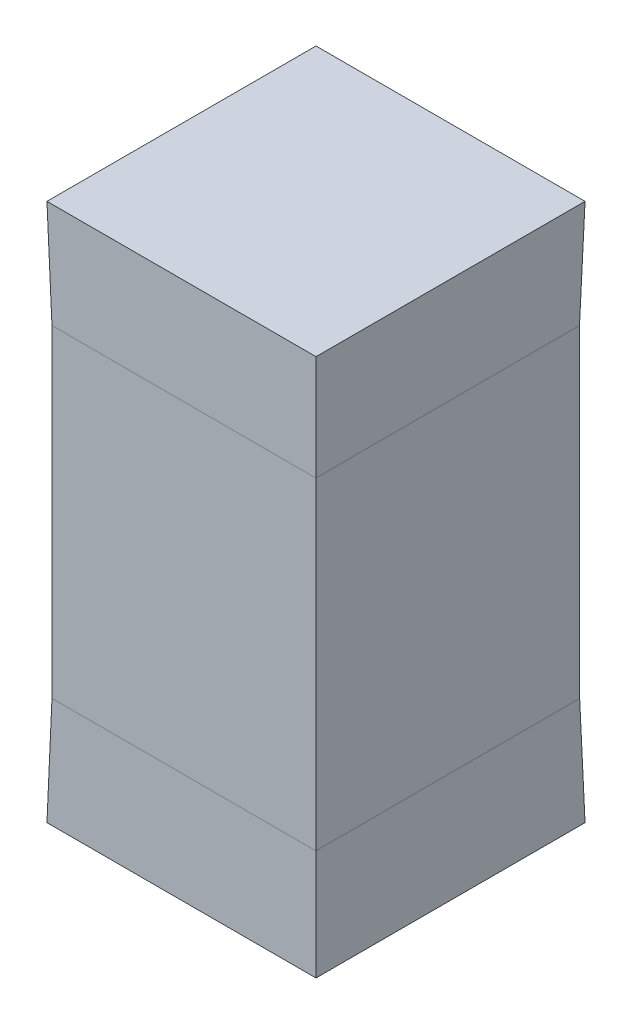
ISO-10303-21;
HEADER;
FILE_DESCRIPTION(('STEP AP214'),'2;1');
FILE_NAME('part.step','',(''),(''),'','','');
FILE_SCHEMA(('AUTOMOTIVE_DESIGN { 1 0 10303 214 1 1 1 1 }'));
ENDSEC;
DATA;
#1=APPLICATION_CONTEXT('core data for automotive mechanical design processes');
#2=APPLICATION_PROTOCOL_DEFINITION('international standard','automotive_design',2000,#1);
#3=PRODUCT_CONTEXT('',#1,'mechanical');
#4=PRODUCT('Part','Part','',(#3));
#5=PRODUCT_RELATED_PRODUCT_CATEGORY('part','',(#4));
#6=PRODUCT_DEFINITION_FORMATION('','',#4);
#7=PRODUCT_DEFINITION_CONTEXT('part definition',#1,'design');
#8=PRODUCT_DEFINITION('design','',#6,#7);
#9=PRODUCT_DEFINITION_SHAPE('','',#8);
#10=(LENGTH_UNIT() NAMED_UNIT(*) SI_UNIT(.MILLI.,.METRE.));
#11=(NAMED_UNIT(*) PLANE_ANGLE_UNIT() SI_UNIT($,.RADIAN.));
#12=(NAMED_UNIT(*) SI_UNIT($,.STERADIAN.) SOLID_ANGLE_UNIT());
#13=UNCERTAINTY_MEASURE_WITH_UNIT(LENGTH_MEASURE(1.E-05),#10,'distance_accuracy_value','');
#14=(GEOMETRIC_REPRESENTATION_CONTEXT(3) GLOBAL_UNCERTAINTY_ASSIGNED_CONTEXT((#13)) GLOBAL_UNIT_ASSIGNED_CONTEXT((#10,
#11,#12)) REPRESENTATION_CONTEXT('',''));
#15=CARTESIAN_POINT('',(0.,0.,0.));
#16=DIRECTION('',(0.,0.,1.));
#17=DIRECTION('',(1.,0.,0.));
#18=AXIS2_PLACEMENT_3D('',#15,#16,#17);
#19=CARTESIAN_POINT('',(0.25,0.5,-0.25));
#20=DIRECTION('',(1.,0.,0.));
#21=DIRECTION('',(0.,0.,-1.));
#22=AXIS2_PLACEMENT_3D('',#19,#20,#21);
#23=PLANE('',#22);
#24=DIRECTION('',(0.,0.,1.));
#25=VECTOR('',#24,1.);
#26=CARTESIAN_POINT('',(0.25,0.5,0.));
#27=LINE('',#26,#25);
#28=CARTESIAN_POINT('',(0.25,0.5,0.25));
#29=VERTEX_POINT('',#28);
#30=CARTESIAN_POINT('',(0.25,0.5,-0.25));
#31=VERTEX_POINT('',#30);
#32=EDGE_CURVE('E83',#29,#31,#27,.F.);
#33=ORIENTED_EDGE('',*,*,#32,.F.);
#34=CARTESIAN_POINT('',(0.245,0.3,0.25));
#35=DIRECTION('',(0.0249921911602032,0.999687646408123,0.));
#36=VECTOR('',#35,1.);
#37=LINE('',#34,#36);
#38=CARTESIAN_POINT('',(0.245192158520675,0.3,0.245496142736469));
#39=VERTEX_POINT('',#38);
#40=EDGE_CURVE('E89',#39,#29,#37,.T.);
#41=ORIENTED_EDGE('',*,*,#40,.F.);
#42=CARTESIAN_POINT('',(0.25,0.3,0.245));
#43=DIRECTION('',(0.,0.,-1.));
#44=VECTOR('',#43,1.);
#45=LINE('',#42,#44);
#46=CARTESIAN_POINT('',(0.244670613901245,0.3,-0.245000108849644));
#47=VERTEX_POINT('',#46);
#48=EDGE_CURVE('E111',#39,#47,#45,.T.);
#49=ORIENTED_EDGE('',*,*,#48,.T.);
#50=CARTESIAN_POINT('',(0.25,0.5,-0.25));
#51=DIRECTION('',(-0.0323054595849644,-0.999478042420645,0.));
#52=VECTOR('',#51,1.);
#53=LINE('',#50,#52);
#54=EDGE_CURVE('E101',#31,#47,#53,.T.);
#55=ORIENTED_EDGE('',*,*,#54,.F.);
#56=EDGE_LOOP('',(#33,#41,#49,#55));
#57=FACE_BOUND('',#56,.T.);
#58=ADVANCED_FACE('F17',(#57),#23,.T.);
#59=CARTESIAN_POINT('',(0.25,-0.5,-0.25));
#60=DIRECTION('',(-1.,0.,0.));
#61=DIRECTION('',(0.,0.,1.));
#62=AXIS2_PLACEMENT_3D('',#59,#60,#61);
#63=PLANE('',#62);
#64=CARTESIAN_POINT('',(0.25,-0.3,0.25));
#65=DIRECTION('',(0.,-1.,0.));
#66=VECTOR('',#65,1.);
#67=LINE('',#64,#66);
#68=CARTESIAN_POINT('',(0.245192158520675,-0.3,0.245496142736469));
#69=VERTEX_POINT('',#68);
#70=CARTESIAN_POINT('',(0.25,-0.5,0.25));
#71=VERTEX_POINT('',#70);
#72=EDGE_CURVE('E433',#69,#71,#67,.T.);
#73=ORIENTED_EDGE('',*,*,#72,.T.);
#74=DIRECTION('',(0.,0.,-1.));
#75=VECTOR('',#74,1.);
#76=CARTESIAN_POINT('',(0.25,-0.5,0.));
#77=LINE('',#76,#75);
#78=CARTESIAN_POINT('',(0.25,-0.5,-0.25));
#79=VERTEX_POINT('',#78);
#80=EDGE_CURVE('E369',#79,#71,#77,.F.);
#81=ORIENTED_EDGE('',*,*,#80,.F.);
#82=CARTESIAN_POINT('',(0.25,-0.5,-0.25));
#83=DIRECTION('',(0.,1.,0.));
#84=VECTOR('',#83,1.);
#85=LINE('',#82,#84);
#86=CARTESIAN_POINT('',(0.245,-0.3,-0.245));
#87=VERTEX_POINT('',#86);
#88=EDGE_CURVE('E194',#79,#87,#85,.T.);
#89=ORIENTED_EDGE('',*,*,#88,.T.);
#90=CARTESIAN_POINT('',(0.25,-0.3,-0.245));
#91=DIRECTION('',(0.,0.,1.));
#92=VECTOR('',#91,1.);
#93=LINE('',#90,#92);
#94=EDGE_CURVE('E113',#87,#69,#93,.T.);
#95=ORIENTED_EDGE('',*,*,#94,.T.);
#96=EDGE_LOOP('',(#73,#81,#89,#95));
#97=FACE_BOUND('',#96,.T.);
#98=ADVANCED_FACE('F439',(#97),#63,.F.);
#99=CARTESIAN_POINT('',(0.,0.5,0.));
#100=DIRECTION('',(0.,1.,0.));
#101=DIRECTION('',(0.,0.,1.));
#102=AXIS2_PLACEMENT_3D('',#99,#100,#101);
#103=PLANE('',#102);
#104=DIRECTION('',(1.,0.,0.));
#105=VECTOR('',#104,1.);
#106=CARTESIAN_POINT('',(0.25,0.5,0.25));
#107=LINE('',#106,#105);
#108=CARTESIAN_POINT('',(-0.25,0.5,0.25));
#109=VERTEX_POINT('',#108);
#110=EDGE_CURVE('E93',#29,#109,#107,.F.);
#111=ORIENTED_EDGE('',*,*,#110,.F.);
#112=ORIENTED_EDGE('',*,*,#32,.T.);
#113=DIRECTION('',(-1.,0.,0.));
#114=VECTOR('',#113,1.);
#115=CARTESIAN_POINT('',(-0.25,0.5,-0.25));
#116=LINE('',#115,#114);
#117=CARTESIAN_POINT('',(-0.25,0.5,-0.25));
#118=VERTEX_POINT('',#117);
#119=EDGE_CURVE('E106',#118,#31,#116,.F.);
#120=ORIENTED_EDGE('',*,*,#119,.F.);
#121=DIRECTION('',(0.,0.,1.));
#122=VECTOR('',#121,1.);
#123=CARTESIAN_POINT('',(-0.25,0.5,0.25));
#124=LINE('',#123,#122);
#125=EDGE_CURVE('E110',#109,#118,#124,.F.);
#126=ORIENTED_EDGE('',*,*,#125,.F.);
#127=EDGE_LOOP('',(#111,#112,#120,#126));
#128=FACE_BOUND('',#127,.T.);
#129=ADVANCED_FACE('F109',(#128),#103,.T.);
#130=CARTESIAN_POINT('',(-0.25,0.5,-0.25));
#131=DIRECTION('',(0.,0.,-1.));
#132=DIRECTION('',(-1.,0.,0.));
#133=AXIS2_PLACEMENT_3D('',#130,#131,#132);
#134=PLANE('',#133);
#135=ORIENTED_EDGE('',*,*,#119,.T.);
#136=ORIENTED_EDGE('',*,*,#54,.T.);
#137=CARTESIAN_POINT('',(0.243535533905933,0.3,-0.25));
#138=DIRECTION('',(-1.,0.,0.));
#139=VECTOR('',#138,1.);
#140=LINE('',#137,#139);
#141=CARTESIAN_POINT('',(-0.245496142736469,0.3,-0.245192158520675));
#142=VERTEX_POINT('',#141);
#143=EDGE_CURVE('E167',#47,#142,#140,.T.);
#144=ORIENTED_EDGE('',*,*,#143,.T.);
#145=CARTESIAN_POINT('',(-0.25,0.5,-0.25));
#146=DIRECTION('',(0.,-0.999687646408123,0.0249921911602032));
#147=VECTOR('',#146,1.);
#148=LINE('',#145,#147);
#149=EDGE_CURVE('E290',#118,#142,#148,.T.);
#150=ORIENTED_EDGE('',*,*,#149,.F.);
#151=EDGE_LOOP('',(#135,#136,#144,#150));
#152=FACE_BOUND('',#151,.T.);
#153=ADVANCED_FACE('F137',(#152),#134,.T.);
#154=CARTESIAN_POINT('',(0.25,0.5,0.25));
#155=DIRECTION('',(0.,0.,1.));
#156=DIRECTION('',(1.,0.,0.));
#157=AXIS2_PLACEMENT_3D('',#154,#155,#156);
#158=PLANE('',#157);
#159=ORIENTED_EDGE('',*,*,#110,.T.);
#160=CARTESIAN_POINT('',(-0.25,0.3,0.245));
#161=DIRECTION('',(0.,0.999687646408123,0.0249921911602029));
#162=VECTOR('',#161,1.);
#163=LINE('',#160,#162);
#164=CARTESIAN_POINT('',(-0.245496142736469,0.3,0.245192158520675));
#165=VERTEX_POINT('',#164);
#166=EDGE_CURVE('E121',#165,#109,#163,.T.);
#167=ORIENTED_EDGE('',*,*,#166,.F.);
#168=CARTESIAN_POINT('',(-0.245,0.3,0.25));
#169=DIRECTION('',(1.,0.,0.));
#170=VECTOR('',#169,1.);
#171=LINE('',#168,#170);
#172=EDGE_CURVE('E95',#165,#39,#171,.T.);
#173=ORIENTED_EDGE('',*,*,#172,.T.);
#174=ORIENTED_EDGE('',*,*,#40,.T.);
#175=EDGE_LOOP('',(#159,#167,#173,#174));
#176=FACE_BOUND('',#175,.T.);
#177=ADVANCED_FACE('F91',(#176),#158,.T.);
#178=CARTESIAN_POINT('',(0.24,0.3,-0.24));
#179=DIRECTION('',(-1.,0.,0.));
#180=DIRECTION('',(0.,0.,1.));
#181=AXIS2_PLACEMENT_3D('',#178,#179,#180);
#182=PLANE('',#181);
#183=CARTESIAN_POINT('',(0.24,-0.3,-0.24));
#184=DIRECTION('',(0.,1.,0.));
#185=VECTOR('',#184,1.);
#186=LINE('',#183,#185);
#187=EDGE_CURVE('E182',#87,#47,#186,.T.);
#188=ORIENTED_EDGE('',*,*,#187,.T.);
#189=ORIENTED_EDGE('',*,*,#48,.F.);
#190=CARTESIAN_POINT('',(0.24,0.3,0.245));
#191=DIRECTION('',(0.,-1.,0.));
#192=VECTOR('',#191,1.);
#193=LINE('',#190,#192);
#194=EDGE_CURVE('E407',#39,#69,#193,.T.);
#195=ORIENTED_EDGE('',*,*,#194,.T.);
#196=ORIENTED_EDGE('',*,*,#94,.F.);
#197=EDGE_LOOP('',(#188,#189,#195,#196));
#198=FACE_BOUND('',#197,.T.);
#199=ADVANCED_FACE('F136',(#198),#182,.F.);
#200=CARTESIAN_POINT('',(0.25,-0.5,0.25));
#201=DIRECTION('',(0.,0.,-1.));
#202=DIRECTION('',(-1.,0.,0.));
#203=AXIS2_PLACEMENT_3D('',#200,#201,#202);
#204=PLANE('',#203);
#205=CARTESIAN_POINT('',(-0.25,-0.3,0.25));
#206=DIRECTION('',(0.,-1.,0.));
#207=VECTOR('',#206,1.);
#208=LINE('',#205,#207);
#209=CARTESIAN_POINT('',(-0.245496142736469,-0.3,0.245192158520675));
#210=VERTEX_POINT('',#209);
#211=CARTESIAN_POINT('',(-0.25,-0.5,0.25));
#212=VERTEX_POINT('',#211);
#213=EDGE_CURVE('E36',#210,#212,#208,.T.);
#214=ORIENTED_EDGE('',*,*,#213,.T.);
#215=DIRECTION('',(1.,0.,0.));
#216=VECTOR('',#215,1.);
#217=CARTESIAN_POINT('',(0.,-0.5,0.25));
#218=LINE('',#217,#216);
#219=EDGE_CURVE('E361',#71,#212,#218,.F.);
#220=ORIENTED_EDGE('',*,*,#219,.F.);
#221=ORIENTED_EDGE('',*,*,#72,.F.);
#222=CARTESIAN_POINT('',(0.245,-0.3,0.25));
#223=DIRECTION('',(-1.,0.,0.));
#224=VECTOR('',#223,1.);
#225=LINE('',#222,#224);
#226=EDGE_CURVE('E340',#69,#210,#225,.T.);
#227=ORIENTED_EDGE('',*,*,#226,.T.);
#228=EDGE_LOOP('',(#214,#220,#221,#227));
#229=FACE_BOUND('',#228,.T.);
#230=ADVANCED_FACE('F385',(#229),#204,.F.);
#231=CARTESIAN_POINT('',(0.,-0.5,0.));
#232=DIRECTION('',(0.,-1.,0.));
#233=DIRECTION('',(0.,0.,-1.));
#234=AXIS2_PLACEMENT_3D('',#231,#232,#233);
#235=PLANE('',#234);
#236=ORIENTED_EDGE('',*,*,#219,.T.);
#237=DIRECTION('',(0.,0.,-1.));
#238=VECTOR('',#237,1.);
#239=CARTESIAN_POINT('',(-0.25,-0.5,0.25));
#240=LINE('',#239,#238);
#241=CARTESIAN_POINT('',(-0.25,-0.5,-0.25));
#242=VERTEX_POINT('',#241);
#243=EDGE_CURVE('E355',#212,#242,#240,.T.);
#244=ORIENTED_EDGE('',*,*,#243,.T.);
#245=DIRECTION('',(1.,0.,0.));
#246=VECTOR('',#245,1.);
#247=CARTESIAN_POINT('',(-0.25,-0.5,-0.25));
#248=LINE('',#247,#246);
#249=EDGE_CURVE('E359',#242,#79,#248,.T.);
#250=ORIENTED_EDGE('',*,*,#249,.T.);
#251=ORIENTED_EDGE('',*,*,#80,.T.);
#252=EDGE_LOOP('',(#236,#244,#250,#251));
#253=FACE_BOUND('',#252,.T.);
#254=ADVANCED_FACE('F227',(#253),#235,.T.);
#255=CARTESIAN_POINT('',(-0.25,-0.5,-0.25));
#256=DIRECTION('',(0.,0.,1.));
#257=DIRECTION('',(1.,0.,0.));
#258=AXIS2_PLACEMENT_3D('',#255,#256,#257);
#259=PLANE('',#258);
#260=ORIENTED_EDGE('',*,*,#88,.F.);
#261=ORIENTED_EDGE('',*,*,#249,.F.);
#262=CARTESIAN_POINT('',(-0.25,-0.5,-0.25));
#263=DIRECTION('',(0.,1.,0.));
#264=VECTOR('',#263,1.);
#265=LINE('',#262,#264);
#266=CARTESIAN_POINT('',(-0.245496142736469,-0.3,-0.245192158520675));
#267=VERTEX_POINT('',#266);
#268=EDGE_CURVE('E345',#242,#267,#265,.T.);
#269=ORIENTED_EDGE('',*,*,#268,.T.);
#270=CARTESIAN_POINT('',(-0.245,-0.3,-0.25));
#271=DIRECTION('',(1.,0.,0.));
#272=VECTOR('',#271,1.);
#273=LINE('',#270,#272);
#274=EDGE_CURVE('E188',#267,#87,#273,.T.);
#275=ORIENTED_EDGE('',*,*,#274,.T.);
#276=EDGE_LOOP('',(#260,#261,#269,#275));
#277=FACE_BOUND('',#276,.T.);
#278=ADVANCED_FACE('F218',(#277),#259,.F.);
#279=CARTESIAN_POINT('',(-0.24,0.3,-0.24));
#280=DIRECTION('',(0.,0.,1.));
#281=DIRECTION('',(1.,0.,0.));
#282=AXIS2_PLACEMENT_3D('',#279,#280,#281);
#283=PLANE('',#282);
#284=CARTESIAN_POINT('',(-0.245,-0.3,-0.24));
#285=DIRECTION('',(0.,1.,0.));
#286=VECTOR('',#285,1.);
#287=LINE('',#284,#286);
#288=EDGE_CURVE('E186',#267,#142,#287,.T.);
#289=ORIENTED_EDGE('',*,*,#288,.T.);
#290=ORIENTED_EDGE('',*,*,#143,.F.);
#291=ORIENTED_EDGE('',*,*,#187,.F.);
#292=ORIENTED_EDGE('',*,*,#274,.F.);
#293=EDGE_LOOP('',(#289,#290,#291,#292));
#294=FACE_BOUND('',#293,.T.);
#295=ADVANCED_FACE('F181',(#294),#283,.F.);
#296=CARTESIAN_POINT('',(-0.25,0.5,0.25));
#297=DIRECTION('',(-1.,0.,0.));
#298=DIRECTION('',(0.,0.,1.));
#299=AXIS2_PLACEMENT_3D('',#296,#297,#298);
#300=PLANE('',#299);
#301=ORIENTED_EDGE('',*,*,#125,.T.);
#302=ORIENTED_EDGE('',*,*,#149,.T.);
#303=CARTESIAN_POINT('',(-0.25,0.3,-0.245));
#304=DIRECTION('',(0.,0.,1.));
#305=VECTOR('',#304,1.);
#306=LINE('',#303,#305);
#307=EDGE_CURVE('E292',#142,#165,#306,.T.);
#308=ORIENTED_EDGE('',*,*,#307,.T.);
#309=ORIENTED_EDGE('',*,*,#166,.T.);
#310=EDGE_LOOP('',(#301,#302,#308,#309));
#311=FACE_BOUND('',#310,.T.);
#312=ADVANCED_FACE('F257',(#311),#300,.T.);
#313=CARTESIAN_POINT('',(-0.24,0.3,0.24));
#314=DIRECTION('',(0.,0.,-1.));
#315=DIRECTION('',(-1.,0.,0.));
#316=AXIS2_PLACEMENT_3D('',#313,#314,#315);
#317=PLANE('',#316);
#318=ORIENTED_EDGE('',*,*,#194,.F.);
#319=ORIENTED_EDGE('',*,*,#172,.F.);
#320=CARTESIAN_POINT('',(-0.245,0.3,0.24));
#321=DIRECTION('',(0.,-1.,0.));
#322=VECTOR('',#321,1.);
#323=LINE('',#320,#322);
#324=EDGE_CURVE('E29',#165,#210,#323,.T.);
#325=ORIENTED_EDGE('',*,*,#324,.T.);
#326=ORIENTED_EDGE('',*,*,#226,.F.);
#327=EDGE_LOOP('',(#318,#319,#325,#326));
#328=FACE_BOUND('',#327,.T.);
#329=ADVANCED_FACE('F266',(#328),#317,.F.);
#330=CARTESIAN_POINT('',(-0.25,-0.5,0.25));
#331=DIRECTION('',(1.,0.,0.));
#332=DIRECTION('',(0.,0.,-1.));
#333=AXIS2_PLACEMENT_3D('',#330,#331,#332);
#334=PLANE('',#333);
#335=ORIENTED_EDGE('',*,*,#268,.F.);
#336=ORIENTED_EDGE('',*,*,#243,.F.);
#337=ORIENTED_EDGE('',*,*,#213,.F.);
#338=CARTESIAN_POINT('',(-0.25,-0.3,0.245));
#339=DIRECTION('',(0.,0.,-1.));
#340=VECTOR('',#339,1.);
#341=LINE('',#338,#340);
#342=EDGE_CURVE('E11',#210,#267,#341,.T.);
#343=ORIENTED_EDGE('',*,*,#342,.T.);
#344=EDGE_LOOP('',(#335,#336,#337,#343));
#345=FACE_BOUND('',#344,.T.);
#346=ADVANCED_FACE('F308',(#345),#334,.F.);
#347=CARTESIAN_POINT('',(-0.24,0.3,-0.24));
#348=DIRECTION('',(1.,0.,0.));
#349=DIRECTION('',(0.,0.,-1.));
#350=AXIS2_PLACEMENT_3D('',#347,#348,#349);
#351=PLANE('',#350);
#352=ORIENTED_EDGE('',*,*,#324,.F.);
#353=ORIENTED_EDGE('',*,*,#307,.F.);
#354=ORIENTED_EDGE('',*,*,#288,.F.);
#355=ORIENTED_EDGE('',*,*,#342,.F.);
#356=EDGE_LOOP('',(#352,#353,#354,#355));
#357=FACE_BOUND('',#356,.T.);
#358=ADVANCED_FACE('F300',(#357),#351,.F.);
#359=CLOSED_SHELL('',(#58,#98,#129,#153,#177,#199,#230,#254,#278,#295,#312,#329,#346,#358));
#360=MANIFOLD_SOLID_BREP('B1',#359);
#361=ADVANCED_BREP_SHAPE_REPRESENTATION('',(#18,#360),#14);
#362=SHAPE_DEFINITION_REPRESENTATION(#9,#361);
ENDSEC;
END-ISO-10303-21;
